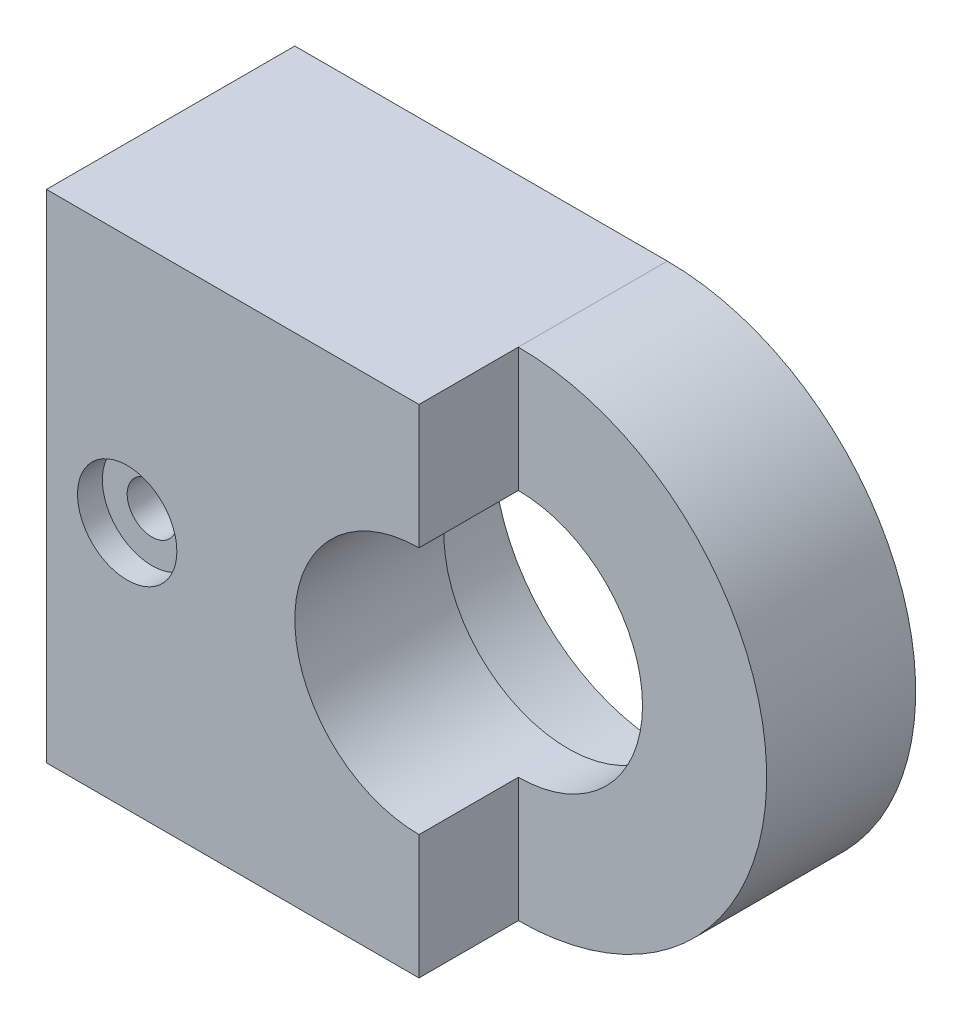
ISO-10303-21;
HEADER;
FILE_DESCRIPTION(('STEP AP214'),'2;1');
FILE_NAME('part.step','',(''),(''),'','','');
FILE_SCHEMA(('AUTOMOTIVE_DESIGN { 1 0 10303 214 1 1 1 1 }'));
ENDSEC;
DATA;
#1=APPLICATION_CONTEXT('core data for automotive mechanical design processes');
#2=APPLICATION_PROTOCOL_DEFINITION('international standard','automotive_design',2000,#1);
#3=PRODUCT_CONTEXT('',#1,'mechanical');
#4=PRODUCT('Part','Part','',(#3));
#5=PRODUCT_RELATED_PRODUCT_CATEGORY('part','',(#4));
#6=PRODUCT_DEFINITION_FORMATION('','',#4);
#7=PRODUCT_DEFINITION_CONTEXT('part definition',#1,'design');
#8=PRODUCT_DEFINITION('design','',#6,#7);
#9=PRODUCT_DEFINITION_SHAPE('','',#8);
#10=(LENGTH_UNIT() NAMED_UNIT(*) SI_UNIT(.MILLI.,.METRE.));
#11=(NAMED_UNIT(*) PLANE_ANGLE_UNIT() SI_UNIT($,.RADIAN.));
#12=(NAMED_UNIT(*) SI_UNIT($,.STERADIAN.) SOLID_ANGLE_UNIT());
#13=UNCERTAINTY_MEASURE_WITH_UNIT(LENGTH_MEASURE(1.E-05),#10,'distance_accuracy_value','');
#14=(GEOMETRIC_REPRESENTATION_CONTEXT(3) GLOBAL_UNCERTAINTY_ASSIGNED_CONTEXT((#13)) GLOBAL_UNIT_ASSIGNED_CONTEXT((#10,
#11,#12)) REPRESENTATION_CONTEXT('',''));
#15=CARTESIAN_POINT('',(0.,0.,0.));
#16=DIRECTION('',(0.,0.,1.));
#17=DIRECTION('',(1.,0.,0.));
#18=AXIS2_PLACEMENT_3D('',#15,#16,#17);
#19=CARTESIAN_POINT('',(0.,0.,20.));
#20=DIRECTION('',(0.,0.,-1.));
#21=DIRECTION('',(-1.,0.,0.));
#22=AXIS2_PLACEMENT_3D('',#19,#20,#21);
#23=CYLINDRICAL_SURFACE('',#22,20.);
#24=CARTESIAN_POINT('',(0.,0.,12.));
#25=DIRECTION('',(0.,0.,1.));
#26=DIRECTION('',(-1.,0.,0.));
#27=AXIS2_PLACEMENT_3D('',#24,#25,#26);
#28=CIRCLE('',#27,20.);
#29=CARTESIAN_POINT('',(0.,-20.,12.));
#30=VERTEX_POINT('',#29);
#31=CARTESIAN_POINT('',(0.,20.,12.));
#32=VERTEX_POINT('',#31);
#33=EDGE_CURVE('E96',#30,#32,#28,.T.);
#34=ORIENTED_EDGE('',*,*,#33,.F.);
#35=DIRECTION('',(0.,0.,-1.));
#36=VECTOR('',#35,1.);
#37=CARTESIAN_POINT('',(0.,-20.,20.));
#38=LINE('',#37,#36);
#39=CARTESIAN_POINT('',(0.,-20.,0.));
#40=VERTEX_POINT('',#39);
#41=EDGE_CURVE('E90',#30,#40,#38,.T.);
#42=ORIENTED_EDGE('',*,*,#41,.T.);
#43=CARTESIAN_POINT('',(0.,0.,0.));
#44=DIRECTION('',(0.,0.,1.));
#45=DIRECTION('',(1.,0.,0.));
#46=AXIS2_PLACEMENT_3D('',#43,#44,#45);
#47=CIRCLE('',#46,20.);
#48=CARTESIAN_POINT('',(0.,20.,0.));
#49=VERTEX_POINT('',#48);
#50=EDGE_CURVE('E94',#40,#49,#47,.T.);
#51=ORIENTED_EDGE('',*,*,#50,.T.);
#52=DIRECTION('',(0.,0.,-1.));
#53=VECTOR('',#52,1.);
#54=CARTESIAN_POINT('',(0.,20.,20.));
#55=LINE('',#54,#53);
#56=EDGE_CURVE('E140',#32,#49,#55,.T.);
#57=ORIENTED_EDGE('',*,*,#56,.F.);
#58=EDGE_LOOP('',(#34,#42,#51,#57));
#59=FACE_BOUND('',#58,.T.);
#60=ADVANCED_FACE('F47',(#59),#23,.T.);
#61=CARTESIAN_POINT('',(-23.5,0.,-1.2E-05));
#62=DIRECTION('',(0.,0.,1.));
#63=DIRECTION('',(1.,0.,0.));
#64=AXIS2_PLACEMENT_3D('',#61,#62,#63);
#65=CYLINDRICAL_SURFACE('',#64,2.);
#66=CARTESIAN_POINT('',(-21.5,0.,15.));
#67=CARTESIAN_POINT('',(-21.5000098518237,0.107493005442895,14.9999927122708));
#68=CARTESIAN_POINT('',(-21.5087177520884,0.215172564090678,14.9964929430693));
#69=CARTESIAN_POINT('',(-21.5432477035212,0.4274964804179,14.9828345310064));
#70=CARTESIAN_POINT('',(-21.5691162790861,0.532131777561252,14.9726577869888));
#71=CARTESIAN_POINT('',(-21.6368760780588,0.734953922727407,14.9467420921312));
#72=CARTESIAN_POINT('',(-21.6787148462167,0.833160661616963,14.9310213636407));
#73=CARTESIAN_POINT('',(-21.7770191733266,1.02107197032837,14.8955661079608));
#74=CARTESIAN_POINT('',(-21.8334796549189,1.110779476751,14.8758329745806));
#75=CARTESIAN_POINT('',(-21.9622354985609,1.2835010075704,14.8333088617042));
#76=CARTESIAN_POINT('',(-22.0351066562403,1.36606227255022,14.8104229692919));
#77=CARTESIAN_POINT('',(-22.1934000034768,1.51817500478472,14.7646057690619));
#78=CARTESIAN_POINT('',(-22.2788282972117,1.58772010713353,14.7416744445379));
#79=CARTESIAN_POINT('',(-22.4644280702423,1.71487456729288,14.6972279179714));
#80=CARTESIAN_POINT('',(-22.5650864860232,1.77181498119547,14.6758211596495));
#81=CARTESIAN_POINT('',(-22.7755363984201,1.86775471903715,14.6383364718679));
#82=CARTESIAN_POINT('',(-22.8853235278484,1.90676256428583,14.6222560124418));
#83=CARTESIAN_POINT('',(-23.1057123335921,1.96389882339587,14.5982635766082));
#84=CARTESIAN_POINT('',(-23.2160512355762,1.98289396580564,14.5900142035561));
#85=CARTESIAN_POINT('',(-23.4386349983073,2.00217296164002,14.5816400404914));
#86=CARTESIAN_POINT('',(-23.550878894625,2.00246601631322,14.5815112552277));
#87=CARTESIAN_POINT('',(-23.7657566714581,1.98498936750454,14.5891050027999));
#88=CARTESIAN_POINT('',(-23.868515714409,1.96847531430513,14.5962817503845));
#89=CARTESIAN_POINT('',(-24.0696595560067,1.91994688029781,14.6167618760784));
#90=CARTESIAN_POINT('',(-24.1680435881103,1.88792979480462,14.6300663232167));
#91=CARTESIAN_POINT('',(-24.3600178361961,1.80869473255106,14.6615948508853));
#92=CARTESIAN_POINT('',(-24.4534692390547,1.76117986231531,14.6799137928079));
#93=CARTESIAN_POINT('',(-24.6314158163616,1.6525064607322,14.7193811638989));
#94=CARTESIAN_POINT('',(-24.7159076094028,1.59134280510083,14.7405306545685));
#95=CARTESIAN_POINT('',(-24.880409728802,1.45155059945442,14.7852673674227));
#96=CARTESIAN_POINT('',(-24.959568729446,1.37193746297062,14.8089166497615));
#97=CARTESIAN_POINT('',(-25.1036844780021,1.20031442743017,14.8545982495828));
#98=CARTESIAN_POINT('',(-25.1686383974103,1.10830206533441,14.8766302444532));
#99=CARTESIAN_POINT('',(-25.2836174474158,0.912077652605824,14.9171468126455));
#100=CARTESIAN_POINT('',(-25.3333222811971,0.807660491346459,14.9355527009541));
#101=CARTESIAN_POINT('',(-25.4141678610781,0.591023765482864,14.9661482832876));
#102=CARTESIAN_POINT('',(-25.4453180375574,0.478808196849657,14.9783411346238));
#103=CARTESIAN_POINT('',(-25.4864482954197,0.256895887607803,14.9945613950691));
#104=CARTESIAN_POINT('',(-25.4975724542536,0.147443293985518,14.9990294583351));
#105=CARTESIAN_POINT('',(-25.5017131005286,-0.0718453098078339,15.0006847851063));
#106=CARTESIAN_POINT('',(-25.4947342815475,-0.18168121322394,14.9978739358229));
#107=CARTESIAN_POINT('',(-25.463708247448,-0.393432739122004,14.9855756706375));
#108=CARTESIAN_POINT('',(-25.440442019649,-0.495482491775491,14.9763939134552));
#109=CARTESIAN_POINT('',(-25.3785642916902,-0.694135428060797,14.952594414055));
#110=CARTESIAN_POINT('',(-25.3399508203313,-0.790737910224861,14.9379759735653));
#111=CARTESIAN_POINT('',(-25.2472150603201,-0.979078785816718,14.9041659477081));
#112=CARTESIAN_POINT('',(-25.1926545279569,-1.07057802275542,14.884848159798));
#113=CARTESIAN_POINT('',(-25.0700596760944,-1.24344359124657,14.8437336474552));
#114=CARTESIAN_POINT('',(-25.0020199570774,-1.32480584076114,14.8219359311027));
#115=CARTESIAN_POINT('',(-24.8491299870504,-1.48072304302883,14.7764511763811));
#116=CARTESIAN_POINT('',(-24.7634664584938,-1.55447393380608,14.7527344142505));
#117=CARTESIAN_POINT('',(-24.5805599169906,-1.68675119741373,14.7074167291713));
#118=CARTESIAN_POINT('',(-24.48331499966,-1.74527506133752,14.6858161552651));
#119=CARTESIAN_POINT('',(-24.2785383054059,-1.84580750193164,14.6471429990771));
#120=CARTESIAN_POINT('',(-24.1709160007877,-1.88765059453447,14.6301163088479));
#121=CARTESIAN_POINT('',(-23.9492663482848,-1.95229621970532,14.6032367347793));
#122=CARTESIAN_POINT('',(-23.8352437941876,-1.97511280526933,14.59337855696));
#123=CARTESIAN_POINT('',(-23.6128720982254,-1.99971561727841,14.5827175929993));
#124=CARTESIAN_POINT('',(-23.5047051604066,-2.00289708230288,14.5813142100817));
#125=CARTESIAN_POINT('',(-23.2894551422867,-1.99180315927753,14.586148360331));
#126=CARTESIAN_POINT('',(-23.1823719260974,-1.97752998791379,14.5923849232479));
#127=CARTESIAN_POINT('',(-22.976667810145,-1.93307136615365,14.6112664907902));
#128=CARTESIAN_POINT('',(-22.877879725567,-1.90353749357098,14.6236483182745));
#129=CARTESIAN_POINT('',(-22.6866213703865,-1.83000544849102,14.653240012327));
#130=CARTESIAN_POINT('',(-22.5941528531002,-1.78600328139382,14.6704512120601));
#131=CARTESIAN_POINT('',(-22.4123903807292,-1.68187276275974,14.7089860960449));
#132=CARTESIAN_POINT('',(-22.3235813298695,-1.62096533515949,14.7304888231324));
#133=CARTESIAN_POINT('',(-22.1570066827962,-1.4858921192715,14.7746380437224));
#134=CARTESIAN_POINT('',(-22.0792444278717,-1.41172233481812,14.7972848804841));
#135=CARTESIAN_POINT('',(-21.9317971467364,-1.24650550627247,14.8429356708739));
#136=CARTESIAN_POINT('',(-21.8629626931019,-1.15467600114614,14.8658675796218));
#137=CARTESIAN_POINT('',(-21.7416629573784,-0.959900320285781,14.9080040671372));
#138=CARTESIAN_POINT('',(-21.6892052878475,-0.856949004547238,14.9272069109291));
#139=CARTESIAN_POINT('',(-21.6033777848097,-0.644738062495202,14.9593971481586));
#140=CARTESIAN_POINT('',(-21.5696706764397,-0.535631618219695,14.9724936305503));
#141=CARTESIAN_POINT('',(-21.5213608790457,-0.312876546281219,14.9914430620937));
#142=CARTESIAN_POINT('',(-21.5066975632561,-0.199243525858911,14.9973189949564));
#143=CARTESIAN_POINT('',(-21.5006046190217,-0.0569122978909272,14.9997589950414));
#144=CARTESIAN_POINT('',(-21.4999973913708,-0.0284626887407554,15.0000019296918));
#145=CARTESIAN_POINT('',(-21.5,0.,15.));
#146=B_SPLINE_CURVE_WITH_KNOTS('',3,(#66,#67,#68,#69,#70,#71,#72,#73,#74,#75,#76,#77,#78,#79,
#80,#81,#82,#83,#84,#85,#86,#87,#88,#89,#90,#91,#92,#93,#94,#95,#96,#97,#98,#99,#100,#101,#102,
#103,#104,#105,#106,#107,#108,#109,#110,#111,#112,#113,#114,#115,#116,#117,#118,#119,#120,#121,
#122,#123,#124,#125,#126,#127,#128,#129,#130,#131,#132,#133,#134,#135,#136,#137,#138,#139,#140,
#141,#142,#143,#144,#145),.UNSPECIFIED.,.T.,.F.,(4,2,2,2,2,2,2,2,2,2,2,2,2,2,2,2,2,2,2,2,2,2,2,
2,2,2,2,2,2,2,2,2,2,2,2,2,2,2,2,4),(0.,0.322402987893072,0.645683636007935,0.967911457471583,
1.29002753567984,1.62597381700397,1.96208394934411,2.31315258819217,2.66405423118268,
2.99904105308828,3.33386306340489,3.64538328401373,3.95695787256048,4.27489126298817,
4.59294421938184,4.93558349186558,5.27829092839734,5.62776913162807,5.97706956113791,
6.30569184528008,6.63422893570083,6.94800455564366,7.26182048993797,7.58523513398264,
7.9087795949897,8.25368474624415,8.59864669043749,8.94695045140828,9.29499672645935,
9.61799673392749,9.94095572563047,10.2511431854877,10.5614163580516,10.8894546805669,
11.2175920134839,11.5670042353384,11.9165786364053,12.2596430101332,12.6016125240434,
12.686980458968),.UNSPECIFIED.);
#147=CARTESIAN_POINT('',(-21.5,0.,15.));
#148=VERTEX_POINT('',#147);
#149=EDGE_CURVE('E153',#148,#148,#146,.T.);
#150=ORIENTED_EDGE('',*,*,#149,.F.);
#151=EDGE_LOOP('',(#150));
#152=FACE_BOUND('',#151,.T.);
#153=CARTESIAN_POINT('',(-23.5,0.,18.));
#154=DIRECTION('',(0.,0.,1.));
#155=DIRECTION('',(1.,0.,0.));
#156=AXIS2_PLACEMENT_3D('',#153,#154,#155);
#157=CIRCLE('',#156,2.);
#158=CARTESIAN_POINT('',(-21.5,0.,18.));
#159=VERTEX_POINT('',#158);
#160=EDGE_CURVE('E202',#159,#159,#157,.F.);
#161=ORIENTED_EDGE('',*,*,#160,.F.);
#162=EDGE_LOOP('',(#161));
#163=FACE_BOUND('',#162,.T.);
#164=ADVANCED_FACE('F170',(#152,#163),#65,.F.);
#165=CARTESIAN_POINT('',(0.,20.,20.));
#166=DIRECTION('',(0.,-1.,0.));
#167=DIRECTION('',(0.,0.,-1.));
#168=AXIS2_PLACEMENT_3D('',#165,#166,#167);
#169=PLANE('',#168);
#170=DIRECTION('',(-1.,0.,0.));
#171=VECTOR('',#170,1.);
#172=CARTESIAN_POINT('',(0.,20.,0.));
#173=LINE('',#172,#171);
#174=CARTESIAN_POINT('',(-30.,20.,0.));
#175=VERTEX_POINT('',#174);
#176=EDGE_CURVE('E117',#49,#175,#173,.T.);
#177=ORIENTED_EDGE('',*,*,#176,.T.);
#178=DIRECTION('',(0.,0.,-1.));
#179=VECTOR('',#178,1.);
#180=CARTESIAN_POINT('',(-30.,20.,20.));
#181=LINE('',#180,#179);
#182=CARTESIAN_POINT('',(-30.,20.,20.));
#183=VERTEX_POINT('',#182);
#184=EDGE_CURVE('E136',#183,#175,#181,.T.);
#185=ORIENTED_EDGE('',*,*,#184,.F.);
#186=DIRECTION('',(-1.,0.,0.));
#187=VECTOR('',#186,1.);
#188=CARTESIAN_POINT('',(0.,20.,20.));
#189=LINE('',#188,#187);
#190=CARTESIAN_POINT('',(0.,20.,20.));
#191=VERTEX_POINT('',#190);
#192=EDGE_CURVE('E112',#191,#183,#189,.T.);
#193=ORIENTED_EDGE('',*,*,#192,.F.);
#194=EDGE_CURVE('E55',#191,#32,#55,.T.);
#195=ORIENTED_EDGE('',*,*,#194,.T.);
#196=ORIENTED_EDGE('',*,*,#56,.T.);
#197=EDGE_LOOP('',(#177,#185,#193,#195,#196));
#198=FACE_BOUND('',#197,.T.);
#199=ADVANCED_FACE('F189',(#198),#169,.F.);
#200=CARTESIAN_POINT('',(-30.,20.,20.));
#201=DIRECTION('',(1.,0.,0.));
#202=DIRECTION('',(0.,0.,-1.));
#203=AXIS2_PLACEMENT_3D('',#200,#201,#202);
#204=PLANE('',#203);
#205=CARTESIAN_POINT('',(-30.,0.,10.));
#206=DIRECTION('',(-1.,0.,0.));
#207=DIRECTION('',(0.,0.,1.));
#208=AXIS2_PLACEMENT_3D('',#205,#206,#207);
#209=CIRCLE('',#208,5.);
#210=CARTESIAN_POINT('',(-30.,0.,15.));
#211=VERTEX_POINT('',#210);
#212=EDGE_CURVE('E228',#211,#211,#209,.T.);
#213=ORIENTED_EDGE('',*,*,#212,.F.);
#214=EDGE_LOOP('',(#213));
#215=FACE_BOUND('',#214,.T.);
#216=DIRECTION('',(0.,-1.,0.));
#217=VECTOR('',#216,1.);
#218=CARTESIAN_POINT('',(-30.,20.,0.));
#219=LINE('',#218,#217);
#220=CARTESIAN_POINT('',(-30.,-20.,0.));
#221=VERTEX_POINT('',#220);
#222=EDGE_CURVE('E113',#175,#221,#219,.T.);
#223=ORIENTED_EDGE('',*,*,#222,.T.);
#224=DIRECTION('',(0.,0.,-1.));
#225=VECTOR('',#224,1.);
#226=CARTESIAN_POINT('',(-30.,-20.,20.));
#227=LINE('',#226,#225);
#228=CARTESIAN_POINT('',(-30.,-20.,20.));
#229=VERTEX_POINT('',#228);
#230=EDGE_CURVE('E108',#229,#221,#227,.T.);
#231=ORIENTED_EDGE('',*,*,#230,.F.);
#232=DIRECTION('',(0.,-1.,0.));
#233=VECTOR('',#232,1.);
#234=CARTESIAN_POINT('',(-30.,20.,20.));
#235=LINE('',#234,#233);
#236=EDGE_CURVE('E70',#183,#229,#235,.T.);
#237=ORIENTED_EDGE('',*,*,#236,.F.);
#238=ORIENTED_EDGE('',*,*,#184,.T.);
#239=EDGE_LOOP('',(#223,#231,#237,#238));
#240=FACE_BOUND('',#239,.T.);
#241=ADVANCED_FACE('F195',(#215,#240),#204,.F.);
#242=CARTESIAN_POINT('',(-30.,-20.,20.));
#243=DIRECTION('',(0.,1.,0.));
#244=DIRECTION('',(0.,0.,1.));
#245=AXIS2_PLACEMENT_3D('',#242,#243,#244);
#246=PLANE('',#245);
#247=DIRECTION('',(1.,0.,0.));
#248=VECTOR('',#247,1.);
#249=CARTESIAN_POINT('',(-30.,-20.,0.));
#250=LINE('',#249,#248);
#251=EDGE_CURVE('E105',#221,#40,#250,.T.);
#252=ORIENTED_EDGE('',*,*,#251,.T.);
#253=ORIENTED_EDGE('',*,*,#41,.F.);
#254=CARTESIAN_POINT('',(0.,-20.,20.));
#255=VERTEX_POINT('',#254);
#256=EDGE_CURVE('E100',#255,#30,#38,.T.);
#257=ORIENTED_EDGE('',*,*,#256,.F.);
#258=DIRECTION('',(1.,0.,0.));
#259=VECTOR('',#258,1.);
#260=CARTESIAN_POINT('',(-30.,-20.,20.));
#261=LINE('',#260,#259);
#262=EDGE_CURVE('E101',#229,#255,#261,.T.);
#263=ORIENTED_EDGE('',*,*,#262,.F.);
#264=ORIENTED_EDGE('',*,*,#230,.T.);
#265=EDGE_LOOP('',(#252,#253,#257,#263,#264));
#266=FACE_BOUND('',#265,.T.);
#267=ADVANCED_FACE('F106',(#266),#246,.F.);
#268=CARTESIAN_POINT('',(0.,0.,20.));
#269=DIRECTION('',(0.,0.,1.));
#270=DIRECTION('',(1.,0.,0.));
#271=AXIS2_PLACEMENT_3D('',#268,#269,#270);
#272=PLANE('',#271);
#273=DIRECTION('',(0.,-1.,0.));
#274=VECTOR('',#273,1.);
#275=CARTESIAN_POINT('',(0.,10.,20.));
#276=LINE('',#275,#274);
#277=CARTESIAN_POINT('',(0.,10.,20.));
#278=VERTEX_POINT('',#277);
#279=EDGE_CURVE('E262',#191,#278,#276,.T.);
#280=ORIENTED_EDGE('',*,*,#279,.F.);
#281=ORIENTED_EDGE('',*,*,#192,.T.);
#282=ORIENTED_EDGE('',*,*,#236,.T.);
#283=ORIENTED_EDGE('',*,*,#262,.T.);
#284=DIRECTION('',(0.,-1.,0.));
#285=VECTOR('',#284,1.);
#286=CARTESIAN_POINT('',(0.,-20.,20.));
#287=LINE('',#286,#285);
#288=CARTESIAN_POINT('',(0.,-10.,20.));
#289=VERTEX_POINT('',#288);
#290=EDGE_CURVE('E246',#289,#255,#287,.T.);
#291=ORIENTED_EDGE('',*,*,#290,.F.);
#292=CARTESIAN_POINT('',(0.,0.,20.));
#293=DIRECTION('',(0.,0.,1.));
#294=DIRECTION('',(1.,0.,0.));
#295=AXIS2_PLACEMENT_3D('',#292,#293,#294);
#296=CIRCLE('',#295,10.);
#297=EDGE_CURVE('E279',#278,#289,#296,.T.);
#298=ORIENTED_EDGE('',*,*,#297,.F.);
#299=EDGE_LOOP('',(#280,#281,#282,#283,#291,#298));
#300=FACE_BOUND('',#299,.T.);
#301=CARTESIAN_POINT('',(-23.5,0.,20.));
#302=DIRECTION('',(0.,0.,1.));
#303=DIRECTION('',(1.,0.,0.));
#304=AXIS2_PLACEMENT_3D('',#301,#302,#303);
#305=CIRCLE('',#304,4.);
#306=CARTESIAN_POINT('',(-19.5,0.,20.));
#307=VERTEX_POINT('',#306);
#308=EDGE_CURVE('E213',#307,#307,#305,.T.);
#309=ORIENTED_EDGE('',*,*,#308,.F.);
#310=EDGE_LOOP('',(#309));
#311=FACE_BOUND('',#310,.T.);
#312=ADVANCED_FACE('F241',(#300,#311),#272,.T.);
#313=CARTESIAN_POINT('',(0.,0.,0.));
#314=DIRECTION('',(0.,0.,1.));
#315=DIRECTION('',(1.,0.,0.));
#316=AXIS2_PLACEMENT_3D('',#313,#314,#315);
#317=PLANE('',#316);
#318=CARTESIAN_POINT('',(-23.5,0.,0.));
#319=DIRECTION('',(0.,0.,1.));
#320=DIRECTION('',(1.,0.,0.));
#321=AXIS2_PLACEMENT_3D('',#318,#319,#320);
#322=CIRCLE('',#321,4.);
#323=CARTESIAN_POINT('',(-19.5,0.,0.));
#324=VERTEX_POINT('',#323);
#325=EDGE_CURVE('E205',#324,#324,#322,.T.);
#326=ORIENTED_EDGE('',*,*,#325,.T.);
#327=EDGE_LOOP('',(#326));
#328=FACE_BOUND('',#327,.T.);
#329=CARTESIAN_POINT('',(0.,0.,0.));
#330=DIRECTION('',(0.,0.,1.));
#331=DIRECTION('',(1.,0.,0.));
#332=AXIS2_PLACEMENT_3D('',#329,#330,#331);
#333=CIRCLE('',#332,14.);
#334=CARTESIAN_POINT('',(14.,0.,0.));
#335=VERTEX_POINT('',#334);
#336=EDGE_CURVE('E125',#335,#335,#333,.T.);
#337=ORIENTED_EDGE('',*,*,#336,.T.);
#338=EDGE_LOOP('',(#337));
#339=FACE_BOUND('',#338,.T.);
#340=ORIENTED_EDGE('',*,*,#50,.F.);
#341=ORIENTED_EDGE('',*,*,#251,.F.);
#342=ORIENTED_EDGE('',*,*,#222,.F.);
#343=ORIENTED_EDGE('',*,*,#176,.F.);
#344=EDGE_LOOP('',(#340,#341,#342,#343));
#345=FACE_BOUND('',#344,.T.);
#346=ADVANCED_FACE('F116',(#328,#339,#345),#317,.F.);
#347=CARTESIAN_POINT('',(0.,0.,8.));
#348=DIRECTION('',(0.,0.,-1.));
#349=DIRECTION('',(-1.,0.,0.));
#350=AXIS2_PLACEMENT_3D('',#347,#348,#349);
#351=CYLINDRICAL_SURFACE('',#350,14.);
#352=CARTESIAN_POINT('',(0.,0.,8.));
#353=DIRECTION('',(0.,0.,1.));
#354=DIRECTION('',(1.,0.,0.));
#355=AXIS2_PLACEMENT_3D('',#352,#353,#354);
#356=CIRCLE('',#355,14.);
#357=CARTESIAN_POINT('',(14.,0.,8.));
#358=VERTEX_POINT('',#357);
#359=EDGE_CURVE('E119',#358,#358,#356,.T.);
#360=ORIENTED_EDGE('',*,*,#359,.T.);
#361=EDGE_LOOP('',(#360));
#362=FACE_BOUND('',#361,.T.);
#363=ORIENTED_EDGE('',*,*,#336,.F.);
#364=EDGE_LOOP('',(#363));
#365=FACE_BOUND('',#364,.T.);
#366=ADVANCED_FACE('F301',(#362,#365),#351,.F.);
#367=CARTESIAN_POINT('',(0.,0.,8.));
#368=DIRECTION('',(0.,0.,1.));
#369=DIRECTION('',(1.,0.,0.));
#370=AXIS2_PLACEMENT_3D('',#367,#368,#369);
#371=PLANE('',#370);
#372=CARTESIAN_POINT('',(0.,0.,8.));
#373=DIRECTION('',(0.,0.,1.));
#374=DIRECTION('',(1.,0.,0.));
#375=AXIS2_PLACEMENT_3D('',#372,#373,#374);
#376=CIRCLE('',#375,10.);
#377=CARTESIAN_POINT('',(10.,0.,8.));
#378=VERTEX_POINT('',#377);
#379=EDGE_CURVE('E284',#378,#378,#376,.F.);
#380=ORIENTED_EDGE('',*,*,#379,.F.);
#381=EDGE_LOOP('',(#380));
#382=FACE_BOUND('',#381,.T.);
#383=ORIENTED_EDGE('',*,*,#359,.F.);
#384=EDGE_LOOP('',(#383));
#385=FACE_BOUND('',#384,.T.);
#386=ADVANCED_FACE('F180',(#382,#385),#371,.F.);
#387=CARTESIAN_POINT('',(-16.,0.,10.));
#388=DIRECTION('',(-1.,0.,0.));
#389=DIRECTION('',(0.,0.,1.));
#390=AXIS2_PLACEMENT_3D('',#387,#388,#389);
#391=CYLINDRICAL_SURFACE('',#390,5.);
#392=ORIENTED_EDGE('',*,*,#149,.T.);
#393=EDGE_LOOP('',(#392));
#394=FACE_BOUND('',#393,.T.);
#395=CARTESIAN_POINT('',(-21.5,0.,5.));
#396=CARTESIAN_POINT('',(-21.5000098518237,-0.107493005442898,5.00000728772915));
#397=CARTESIAN_POINT('',(-21.5087177520884,-0.21517256409068,5.00350705693068));
#398=CARTESIAN_POINT('',(-21.5432477035212,-0.427496480417903,5.01716546899359));
#399=CARTESIAN_POINT('',(-21.5691162790861,-0.532131777561255,5.02734221301123));
#400=CARTESIAN_POINT('',(-21.6368760780588,-0.73495392272741,5.05325790786882));
#401=CARTESIAN_POINT('',(-21.6787148462167,-0.833160661616966,5.06897863635928));
#402=CARTESIAN_POINT('',(-21.7770191733265,-1.02107197032838,5.10443389203922));
#403=CARTESIAN_POINT('',(-21.8334796549189,-1.110779476751,5.12416702541944));
#404=CARTESIAN_POINT('',(-21.9622354985609,-1.2835010075704,5.16669113829582));
#405=CARTESIAN_POINT('',(-22.0351066562403,-1.36606227255022,5.1895770307081));
#406=CARTESIAN_POINT('',(-22.1934000034768,-1.51817500478473,5.23539423093806));
#407=CARTESIAN_POINT('',(-22.2788282972117,-1.58772010713354,5.25832555546208));
#408=CARTESIAN_POINT('',(-22.4644280702423,-1.71487456729289,5.30277208202864));
#409=CARTESIAN_POINT('',(-22.5650864860232,-1.77181498119548,5.32417884035049));
#410=CARTESIAN_POINT('',(-22.77553639842,-1.86775471903716,5.36166352813208));
#411=CARTESIAN_POINT('',(-22.8853235278484,-1.90676256428584,5.37774398755825));
#412=CARTESIAN_POINT('',(-23.1057123335921,-1.96389882339588,5.40173642339182));
#413=CARTESIAN_POINT('',(-23.2160512355762,-1.98289396580566,5.40998579644396));
#414=CARTESIAN_POINT('',(-23.4386349983073,-2.00217296164004,5.41835995950857));
#415=CARTESIAN_POINT('',(-23.550878894625,-2.00246601631323,5.41848874477233));
#416=CARTESIAN_POINT('',(-23.765756671458,-1.98498936750455,5.41089499720007));
#417=CARTESIAN_POINT('',(-23.868515714409,-1.96847531430515,5.40371824961551));
#418=CARTESIAN_POINT('',(-24.0696595560067,-1.91994688029783,5.38323812392165));
#419=CARTESIAN_POINT('',(-24.1680435881103,-1.88792979480464,5.36993367678328));
#420=CARTESIAN_POINT('',(-24.360017836196,-1.80869473255108,5.33840514911471));
#421=CARTESIAN_POINT('',(-24.4534692390547,-1.76117986231533,5.32008620719213));
#422=CARTESIAN_POINT('',(-24.6314158163616,-1.65250646073222,5.28061883610111));
#423=CARTESIAN_POINT('',(-24.7159076094028,-1.59134280510085,5.25946934543152));
#424=CARTESIAN_POINT('',(-24.880409728802,-1.45155059945444,5.2147326325773));
#425=CARTESIAN_POINT('',(-24.959568729446,-1.37193746297064,5.19108335023849));
#426=CARTESIAN_POINT('',(-25.103684478002,-1.2003144274302,5.14540175041718));
#427=CARTESIAN_POINT('',(-25.1686383974103,-1.10830206533444,5.12336975554676));
#428=CARTESIAN_POINT('',(-25.2836174474158,-0.91207765260585,5.08285318735452));
#429=CARTESIAN_POINT('',(-25.3333222811971,-0.807660491346484,5.06444729904586));
#430=CARTESIAN_POINT('',(-25.4141678610781,-0.591023765482889,5.03385171671241));
#431=CARTESIAN_POINT('',(-25.4453180375574,-0.478808196849682,5.02165886537618));
#432=CARTESIAN_POINT('',(-25.4864482954197,-0.256895887607829,5.0054386049309));
#433=CARTESIAN_POINT('',(-25.4975724542536,-0.147443293985543,5.00097054166486));
#434=CARTESIAN_POINT('',(-25.5017131005286,0.0718453098078091,4.99931521489369));
#435=CARTESIAN_POINT('',(-25.4947342815475,0.181681213223916,5.00212606417709));
#436=CARTESIAN_POINT('',(-25.463708247448,0.39343273912198,5.01442432936247));
#437=CARTESIAN_POINT('',(-25.440442019649,0.495482491775467,5.02360608654477));
#438=CARTESIAN_POINT('',(-25.3785642916902,0.694135428060773,5.047405585945));
#439=CARTESIAN_POINT('',(-25.3399508203313,0.790737910224838,5.0620240264347));
#440=CARTESIAN_POINT('',(-25.2472150603201,0.979078785816696,5.09583405229188));
#441=CARTESIAN_POINT('',(-25.1926545279569,1.0705780227554,5.11515184020197));
#442=CARTESIAN_POINT('',(-25.0700596760944,1.24344359124655,5.15626635254475));
#443=CARTESIAN_POINT('',(-25.0020199570774,1.32480584076112,5.1780640688973));
#444=CARTESIAN_POINT('',(-24.8491299870504,1.48072304302881,5.22354882361888));
#445=CARTESIAN_POINT('',(-24.7634664584938,1.55447393380606,5.24726558574948));
#446=CARTESIAN_POINT('',(-24.5805599169906,1.68675119741371,5.29258327082868));
#447=CARTESIAN_POINT('',(-24.4833149996601,1.7452750613375,5.31418384473489));
#448=CARTESIAN_POINT('',(-24.2785383054059,1.84580750193162,5.35285700092291));
#449=CARTESIAN_POINT('',(-24.1709160007877,1.88765059453445,5.36988369115212));
#450=CARTESIAN_POINT('',(-23.9492663482849,1.9522962197053,5.39676326522068));
#451=CARTESIAN_POINT('',(-23.8352437941876,1.97511280526931,5.40662144304002));
#452=CARTESIAN_POINT('',(-23.6128720982255,1.9997156172784,5.41728240700074));
#453=CARTESIAN_POINT('',(-23.5047051604067,2.00289708230286,5.41868578991828));
#454=CARTESIAN_POINT('',(-23.2894551422867,1.99180315927752,5.41385163966902));
#455=CARTESIAN_POINT('',(-23.1823719260974,1.97752998791378,5.40761507675206));
#456=CARTESIAN_POINT('',(-22.976667810145,1.93307136615364,5.38873350920979));
#457=CARTESIAN_POINT('',(-22.877879725567,1.90353749357097,5.37635168172551));
#458=CARTESIAN_POINT('',(-22.6866213703865,1.83000544849101,5.34675998767303));
#459=CARTESIAN_POINT('',(-22.5941528531002,1.78600328139381,5.32954878793993));
#460=CARTESIAN_POINT('',(-22.4123903807292,1.68187276275973,5.29101390395509));
#461=CARTESIAN_POINT('',(-22.3235813298695,1.62096533515949,5.26951117686758));
#462=CARTESIAN_POINT('',(-22.1570066827962,1.48589211927149,5.22536195627763));
#463=CARTESIAN_POINT('',(-22.0792444278717,1.41172233481812,5.20271511951594));
#464=CARTESIAN_POINT('',(-21.9317971467364,1.24650550627246,5.15706432912606));
#465=CARTESIAN_POINT('',(-21.8629626931019,1.15467600114613,5.13413242037815));
#466=CARTESIAN_POINT('',(-21.7416629573784,0.959900320285774,5.09199593286283));
#467=CARTESIAN_POINT('',(-21.6892052878475,0.856949004547232,5.07279308907094));
#468=CARTESIAN_POINT('',(-21.6033777848097,0.644738062495197,5.04060285184139));
#469=CARTESIAN_POINT('',(-21.5696706764397,0.53563161821969,5.02750636944972));
#470=CARTESIAN_POINT('',(-21.5213608790457,0.312876546281214,5.00855693790634));
#471=CARTESIAN_POINT('',(-21.5066975632561,0.199243525858906,5.00268100504363));
#472=CARTESIAN_POINT('',(-21.5006046190217,0.0569122978909226,5.00024100495864));
#473=CARTESIAN_POINT('',(-21.4999973913708,0.0284626887407514,4.99999807030824));
#474=CARTESIAN_POINT('',(-21.5,0.,5.));
#475=B_SPLINE_CURVE_WITH_KNOTS('',3,(#395,#396,#397,#398,#399,#400,#401,#402,#403,#404,#405,
#406,#407,#408,#409,#410,#411,#412,#413,#414,#415,#416,#417,#418,#419,#420,#421,#422,#423,#424,
#425,#426,#427,#428,#429,#430,#431,#432,#433,#434,#435,#436,#437,#438,#439,#440,#441,#442,#443,
#444,#445,#446,#447,#448,#449,#450,#451,#452,#453,#454,#455,#456,#457,#458,#459,#460,#461,#462,
#463,#464,#465,#466,#467,#468,#469,#470,#471,#472,#473,#474),.UNSPECIFIED.,.T.,.F.,(4,2,2,2,2,2,
2,2,2,2,2,2,2,2,2,2,2,2,2,2,2,2,2,2,2,2,2,2,2,2,2,2,2,2,2,2,2,2,2,4),(0.,0.322402987893071,
0.645683636007935,0.967911457471581,1.29002753567984,1.62597381700398,1.96208394934412,
2.31315258819217,2.66405423118268,2.99904105308829,3.33386306340488,3.64538328401372,
3.95695787256048,4.27489126298816,4.59294421938184,4.93558349186558,5.27829092839734,
5.62776913162807,5.97706956113791,6.30569184528008,6.63422893570083,6.94800455564366,
7.26182048993797,7.58523513398264,7.9087795949897,8.25368474624415,8.59864669043749,
8.94695045140828,9.29499672645935,9.61799673392749,9.94095572563047,10.2511431854877,
10.5614163580516,10.8894546805669,11.2175920134839,11.5670042353384,11.9165786364053,
12.2596430101332,12.6016125240434,12.686980458968),.UNSPECIFIED.);
#476=CARTESIAN_POINT('',(-21.5,0.,5.));
#477=VERTEX_POINT('',#476);
#478=EDGE_CURVE('E144',#477,#477,#475,.T.);
#479=ORIENTED_EDGE('',*,*,#478,.T.);
#480=EDGE_LOOP('',(#479));
#481=FACE_BOUND('',#480,.T.);
#482=CARTESIAN_POINT('',(-16.,0.,10.));
#483=DIRECTION('',(-1.,0.,0.));
#484=DIRECTION('',(0.,0.,1.));
#485=AXIS2_PLACEMENT_3D('',#482,#483,#484);
#486=CIRCLE('',#485,5.);
#487=CARTESIAN_POINT('',(-16.,0.,15.));
#488=VERTEX_POINT('',#487);
#489=EDGE_CURVE('E225',#488,#488,#486,.T.);
#490=ORIENTED_EDGE('',*,*,#489,.F.);
#491=EDGE_LOOP('',(#490));
#492=FACE_BOUND('',#491,.T.);
#493=ORIENTED_EDGE('',*,*,#212,.T.);
#494=EDGE_LOOP('',(#493));
#495=FACE_BOUND('',#494,.T.);
#496=ADVANCED_FACE('F159',(#394,#481,#492,#495),#391,.F.);
#497=CARTESIAN_POINT('',(-16.,0.,10.));
#498=DIRECTION('',(-1.,0.,0.));
#499=DIRECTION('',(0.,0.,1.));
#500=AXIS2_PLACEMENT_3D('',#497,#498,#499);
#501=PLANE('',#500);
#502=ORIENTED_EDGE('',*,*,#489,.T.);
#503=EDGE_LOOP('',(#502));
#504=FACE_BOUND('',#503,.T.);
#505=ADVANCED_FACE('F168',(#504),#501,.T.);
#506=CARTESIAN_POINT('',(-23.5,0.,2.));
#507=DIRECTION('',(0.,0.,1.));
#508=DIRECTION('',(1.,0.,0.));
#509=AXIS2_PLACEMENT_3D('',#506,#507,#508);
#510=CIRCLE('',#509,2.);
#511=CARTESIAN_POINT('',(-21.5,0.,2.));
#512=VERTEX_POINT('',#511);
#513=EDGE_CURVE('E154',#512,#512,#510,.F.);
#514=ORIENTED_EDGE('',*,*,#513,.T.);
#515=EDGE_LOOP('',(#514));
#516=FACE_BOUND('',#515,.T.);
#517=ORIENTED_EDGE('',*,*,#478,.F.);
#518=EDGE_LOOP('',(#517));
#519=FACE_BOUND('',#518,.T.);
#520=ADVANCED_FACE('F163',(#516,#519),#65,.F.);
#521=CARTESIAN_POINT('',(-23.5,0.,2.));
#522=DIRECTION('',(0.,0.,1.));
#523=DIRECTION('',(1.,0.,0.));
#524=AXIS2_PLACEMENT_3D('',#521,#522,#523);
#525=PLANE('',#524);
#526=CARTESIAN_POINT('',(-23.5,0.,2.));
#527=DIRECTION('',(0.,0.,1.));
#528=DIRECTION('',(1.,0.,0.));
#529=AXIS2_PLACEMENT_3D('',#526,#527,#528);
#530=CIRCLE('',#529,4.);
#531=CARTESIAN_POINT('',(-19.5,0.,2.));
#532=VERTEX_POINT('',#531);
#533=EDGE_CURVE('E210',#532,#532,#530,.T.);
#534=ORIENTED_EDGE('',*,*,#533,.F.);
#535=EDGE_LOOP('',(#534));
#536=FACE_BOUND('',#535,.T.);
#537=ORIENTED_EDGE('',*,*,#513,.F.);
#538=EDGE_LOOP('',(#537));
#539=FACE_BOUND('',#538,.T.);
#540=ADVANCED_FACE('F167',(#536,#539),#525,.F.);
#541=CARTESIAN_POINT('',(-23.5,0.,2.));
#542=DIRECTION('',(0.,0.,-1.));
#543=DIRECTION('',(-1.,0.,0.));
#544=AXIS2_PLACEMENT_3D('',#541,#542,#543);
#545=CYLINDRICAL_SURFACE('',#544,4.);
#546=ORIENTED_EDGE('',*,*,#533,.T.);
#547=EDGE_LOOP('',(#546));
#548=FACE_BOUND('',#547,.T.);
#549=ORIENTED_EDGE('',*,*,#325,.F.);
#550=EDGE_LOOP('',(#549));
#551=FACE_BOUND('',#550,.T.);
#552=ADVANCED_FACE('F171',(#548,#551),#545,.F.);
#553=CARTESIAN_POINT('',(-23.5,0.,18.));
#554=DIRECTION('',(0.,0.,1.));
#555=DIRECTION('',(1.,0.,0.));
#556=AXIS2_PLACEMENT_3D('',#553,#554,#555);
#557=PLANE('',#556);
#558=CARTESIAN_POINT('',(-23.5,0.,18.));
#559=DIRECTION('',(0.,0.,1.));
#560=DIRECTION('',(1.,0.,0.));
#561=AXIS2_PLACEMENT_3D('',#558,#559,#560);
#562=CIRCLE('',#561,4.);
#563=CARTESIAN_POINT('',(-19.5,0.,18.));
#564=VERTEX_POINT('',#563);
#565=EDGE_CURVE('E206',#564,#564,#562,.T.);
#566=ORIENTED_EDGE('',*,*,#565,.T.);
#567=EDGE_LOOP('',(#566));
#568=FACE_BOUND('',#567,.T.);
#569=ORIENTED_EDGE('',*,*,#160,.T.);
#570=EDGE_LOOP('',(#569));
#571=FACE_BOUND('',#570,.T.);
#572=ADVANCED_FACE('F332',(#568,#571),#557,.T.);
#573=CARTESIAN_POINT('',(-23.5,0.,18.));
#574=DIRECTION('',(0.,0.,1.));
#575=DIRECTION('',(1.,0.,0.));
#576=AXIS2_PLACEMENT_3D('',#573,#574,#575);
#577=CYLINDRICAL_SURFACE('',#576,4.);
#578=ORIENTED_EDGE('',*,*,#565,.F.);
#579=EDGE_LOOP('',(#578));
#580=FACE_BOUND('',#579,.T.);
#581=ORIENTED_EDGE('',*,*,#308,.T.);
#582=EDGE_LOOP('',(#581));
#583=FACE_BOUND('',#582,.T.);
#584=ADVANCED_FACE('F293',(#580,#583),#577,.F.);
#585=CARTESIAN_POINT('',(0.,0.,-0.001000000000001));
#586=DIRECTION('',(0.,0.,1.));
#587=DIRECTION('',(1.,0.,0.));
#588=AXIS2_PLACEMENT_3D('',#585,#586,#587);
#589=CYLINDRICAL_SURFACE('',#588,10.);
#590=DIRECTION('',(0.,0.,1.));
#591=VECTOR('',#590,1.);
#592=CARTESIAN_POINT('',(0.,-10.,12.));
#593=LINE('',#592,#591);
#594=CARTESIAN_POINT('',(0.,-10.,12.));
#595=VERTEX_POINT('',#594);
#596=EDGE_CURVE('E272',#595,#289,#593,.T.);
#597=ORIENTED_EDGE('',*,*,#596,.F.);
#598=CARTESIAN_POINT('',(0.,0.,12.));
#599=DIRECTION('',(0.,0.,1.));
#600=DIRECTION('',(1.,0.,0.));
#601=AXIS2_PLACEMENT_3D('',#598,#599,#600);
#602=CIRCLE('',#601,10.);
#603=CARTESIAN_POINT('',(0.,10.,12.));
#604=VERTEX_POINT('',#603);
#605=EDGE_CURVE('E11',#604,#595,#602,.F.);
#606=ORIENTED_EDGE('',*,*,#605,.F.);
#607=DIRECTION('',(0.,0.,1.));
#608=VECTOR('',#607,1.);
#609=CARTESIAN_POINT('',(0.,10.,12.));
#610=LINE('',#609,#608);
#611=EDGE_CURVE('E275',#604,#278,#610,.T.);
#612=ORIENTED_EDGE('',*,*,#611,.T.);
#613=ORIENTED_EDGE('',*,*,#297,.T.);
#614=EDGE_LOOP('',(#597,#606,#612,#613));
#615=FACE_BOUND('',#614,.T.);
#616=ORIENTED_EDGE('',*,*,#379,.T.);
#617=EDGE_LOOP('',(#616));
#618=FACE_BOUND('',#617,.T.);
#619=ADVANCED_FACE('F325',(#615,#618),#589,.F.);
#620=CARTESIAN_POINT('',(0.,0.,12.));
#621=DIRECTION('',(0.,0.,1.));
#622=DIRECTION('',(1.,0.,0.));
#623=AXIS2_PLACEMENT_3D('',#620,#621,#622);
#624=PLANE('',#623);
#625=ORIENTED_EDGE('',*,*,#605,.T.);
#626=DIRECTION('',(0.,-1.,0.));
#627=VECTOR('',#626,1.);
#628=CARTESIAN_POINT('',(0.,-20.,12.));
#629=LINE('',#628,#627);
#630=EDGE_CURVE('E256',#595,#30,#629,.T.);
#631=ORIENTED_EDGE('',*,*,#630,.T.);
#632=ORIENTED_EDGE('',*,*,#33,.T.);
#633=DIRECTION('',(0.,-1.,0.));
#634=VECTOR('',#633,1.);
#635=CARTESIAN_POINT('',(0.,10.,12.));
#636=LINE('',#635,#634);
#637=EDGE_CURVE('E61',#32,#604,#636,.T.);
#638=ORIENTED_EDGE('',*,*,#637,.T.);
#639=EDGE_LOOP('',(#625,#631,#632,#638));
#640=FACE_BOUND('',#639,.T.);
#641=ADVANCED_FACE('F259',(#640),#624,.T.);
#642=CARTESIAN_POINT('',(0.,10.,12.));
#643=DIRECTION('',(-1.,0.,0.));
#644=DIRECTION('',(0.,0.,1.));
#645=AXIS2_PLACEMENT_3D('',#642,#643,#644);
#646=PLANE('',#645);
#647=ORIENTED_EDGE('',*,*,#279,.T.);
#648=ORIENTED_EDGE('',*,*,#611,.F.);
#649=ORIENTED_EDGE('',*,*,#637,.F.);
#650=ORIENTED_EDGE('',*,*,#194,.F.);
#651=EDGE_LOOP('',(#647,#648,#649,#650));
#652=FACE_BOUND('',#651,.T.);
#653=ADVANCED_FACE('F323',(#652),#646,.F.);
#654=CARTESIAN_POINT('',(0.,-20.,12.));
#655=DIRECTION('',(-1.,0.,0.));
#656=DIRECTION('',(0.,0.,1.));
#657=AXIS2_PLACEMENT_3D('',#654,#655,#656);
#658=PLANE('',#657);
#659=ORIENTED_EDGE('',*,*,#290,.T.);
#660=ORIENTED_EDGE('',*,*,#256,.T.);
#661=ORIENTED_EDGE('',*,*,#630,.F.);
#662=ORIENTED_EDGE('',*,*,#596,.T.);
#663=EDGE_LOOP('',(#659,#660,#661,#662));
#664=FACE_BOUND('',#663,.T.);
#665=ADVANCED_FACE('F253',(#664),#658,.F.);
#666=CLOSED_SHELL('',(#60,#164,#199,#241,#267,#312,#346,#366,#386,#496,#505,#520,#540,#552,#572,
#584,#619,#641,#653,#665));
#667=MANIFOLD_SOLID_BREP('B2',#666);
#668=ADVANCED_BREP_SHAPE_REPRESENTATION('',(#18,#667),#14);
#669=SHAPE_DEFINITION_REPRESENTATION(#9,#668);
ENDSEC;
END-ISO-10303-21;
